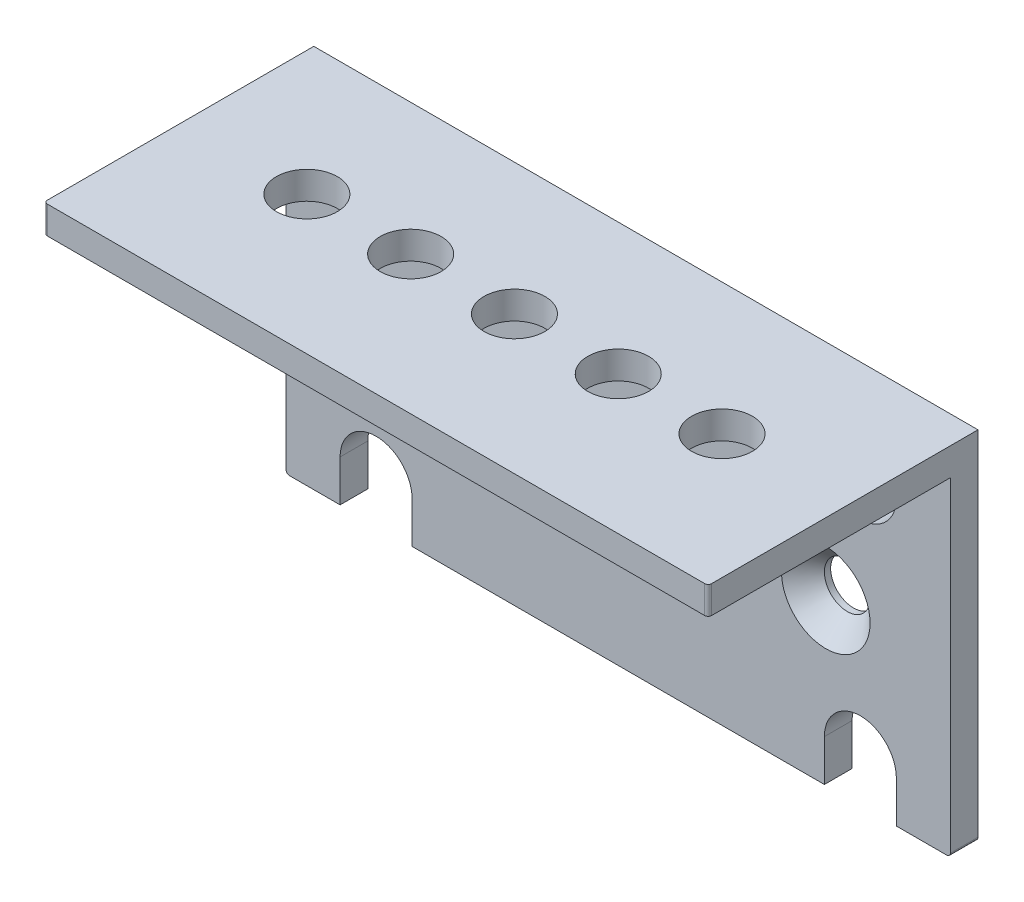
ISO-10303-21;
HEADER;
FILE_DESCRIPTION(('STEP AP214'),'2;1');
FILE_NAME('part.step','',(''),(''),'','','');
FILE_SCHEMA(('AUTOMOTIVE_DESIGN { 1 0 10303 214 1 1 1 1 }'));
ENDSEC;
DATA;
#1=APPLICATION_CONTEXT('core data for automotive mechanical design processes');
#2=APPLICATION_PROTOCOL_DEFINITION('international standard','automotive_design',2000,#1);
#3=PRODUCT_CONTEXT('',#1,'mechanical');
#4=PRODUCT('Part','Part','',(#3));
#5=PRODUCT_RELATED_PRODUCT_CATEGORY('part','',(#4));
#6=PRODUCT_DEFINITION_FORMATION('','',#4);
#7=PRODUCT_DEFINITION_CONTEXT('part definition',#1,'design');
#8=PRODUCT_DEFINITION('design','',#6,#7);
#9=PRODUCT_DEFINITION_SHAPE('','',#8);
#10=(LENGTH_UNIT() NAMED_UNIT(*) SI_UNIT(.MILLI.,.METRE.));
#11=(NAMED_UNIT(*) PLANE_ANGLE_UNIT() SI_UNIT($,.RADIAN.));
#12=(NAMED_UNIT(*) SI_UNIT($,.STERADIAN.) SOLID_ANGLE_UNIT());
#13=UNCERTAINTY_MEASURE_WITH_UNIT(LENGTH_MEASURE(1.E-05),#10,'distance_accuracy_value','');
#14=(GEOMETRIC_REPRESENTATION_CONTEXT(3) GLOBAL_UNCERTAINTY_ASSIGNED_CONTEXT((#13)) GLOBAL_UNIT_ASSIGNED_CONTEXT((#10,
#11,#12)) REPRESENTATION_CONTEXT('',''));
#15=CARTESIAN_POINT('',(0.,0.,0.));
#16=DIRECTION('',(0.,0.,1.));
#17=DIRECTION('',(1.,0.,0.));
#18=AXIS2_PLACEMENT_3D('',#15,#16,#17);
#19=CARTESIAN_POINT('',(96.,-47.,4.));
#20=DIRECTION('',(0.,1.,0.));
#21=DIRECTION('',(-1.,0.,0.));
#22=AXIS2_PLACEMENT_3D('',#19,#20,#21);
#23=PLANE('',#22);
#24=DIRECTION('',(0.,0.,1.));
#25=VECTOR('',#24,1.);
#26=CARTESIAN_POINT('',(18.2,-47.,-6.));
#27=LINE('',#26,#25);
#28=CARTESIAN_POINT('',(18.2,-47.,0.));
#29=VERTEX_POINT('',#28);
#30=CARTESIAN_POINT('',(18.2,-47.,4.));
#31=VERTEX_POINT('',#30);
#32=EDGE_CURVE('E219',#29,#31,#27,.T.);
#33=ORIENTED_EDGE('',*,*,#32,.F.);
#34=DIRECTION('',(1.,0.,0.));
#35=VECTOR('',#34,1.);
#36=CARTESIAN_POINT('',(96.,-47.,0.));
#37=LINE('',#36,#35);
#38=CARTESIAN_POINT('',(77.8,-47.,0.));
#39=VERTEX_POINT('',#38);
#40=EDGE_CURVE('E301',#29,#39,#37,.T.);
#41=ORIENTED_EDGE('',*,*,#40,.T.);
#42=DIRECTION('',(0.,0.,1.));
#43=VECTOR('',#42,1.);
#44=CARTESIAN_POINT('',(77.8,-47.,-6.));
#45=LINE('',#44,#43);
#46=CARTESIAN_POINT('',(77.8,-47.,4.));
#47=VERTEX_POINT('',#46);
#48=EDGE_CURVE('E552',#39,#47,#45,.T.);
#49=ORIENTED_EDGE('',*,*,#48,.T.);
#50=DIRECTION('',(1.,0.,0.));
#51=VECTOR('',#50,1.);
#52=CARTESIAN_POINT('',(96.,-47.,4.));
#53=LINE('',#52,#51);
#54=EDGE_CURVE('E293',#31,#47,#53,.T.);
#55=ORIENTED_EDGE('',*,*,#54,.F.);
#56=EDGE_LOOP('',(#33,#41,#49,#55));
#57=FACE_BOUND('',#56,.T.);
#58=ADVANCED_FACE('F53',(#57),#23,.F.);
#59=CARTESIAN_POINT('',(0.500000000000028,-47.,4.));
#60=VERTEX_POINT('',#59);
#61=CARTESIAN_POINT('',(7.80000000000001,-47.,4.));
#62=VERTEX_POINT('',#61);
#63=EDGE_CURVE('E290',#60,#62,#53,.T.);
#64=ORIENTED_EDGE('',*,*,#63,.F.);
#65=DIRECTION('',(0.,0.,-1.));
#66=VECTOR('',#65,1.);
#67=CARTESIAN_POINT('',(0.5,-47.,4.));
#68=LINE('',#67,#66);
#69=CARTESIAN_POINT('',(0.500000000000028,-47.,0.));
#70=VERTEX_POINT('',#69);
#71=EDGE_CURVE('E320',#60,#70,#68,.T.);
#72=ORIENTED_EDGE('',*,*,#71,.T.);
#73=CARTESIAN_POINT('',(7.80000000000004,-47.,0.));
#74=VERTEX_POINT('',#73);
#75=EDGE_CURVE('E299',#70,#74,#37,.T.);
#76=ORIENTED_EDGE('',*,*,#75,.T.);
#77=DIRECTION('',(0.,0.,1.));
#78=VECTOR('',#77,1.);
#79=CARTESIAN_POINT('',(7.80000000000001,-47.,-6.));
#80=LINE('',#79,#78);
#81=EDGE_CURVE('E216',#74,#62,#80,.T.);
#82=ORIENTED_EDGE('',*,*,#81,.T.);
#83=EDGE_LOOP('',(#64,#72,#76,#82));
#84=FACE_BOUND('',#83,.T.);
#85=ADVANCED_FACE('F383',(#84),#23,.F.);
#86=CARTESIAN_POINT('',(88.2,-47.,0.));
#87=VERTEX_POINT('',#86);
#88=CARTESIAN_POINT('',(95.5,-47.,0.));
#89=VERTEX_POINT('',#88);
#90=EDGE_CURVE('E298',#87,#89,#37,.T.);
#91=ORIENTED_EDGE('',*,*,#90,.T.);
#92=DIRECTION('',(0.,0.,-1.));
#93=VECTOR('',#92,1.);
#94=CARTESIAN_POINT('',(95.5,-47.,4.));
#95=LINE('',#94,#93);
#96=CARTESIAN_POINT('',(95.5,-47.,4.));
#97=VERTEX_POINT('',#96);
#98=EDGE_CURVE('E341',#89,#97,#95,.F.);
#99=ORIENTED_EDGE('',*,*,#98,.T.);
#100=CARTESIAN_POINT('',(88.2,-47.,4.));
#101=VERTEX_POINT('',#100);
#102=EDGE_CURVE('E288',#101,#97,#53,.T.);
#103=ORIENTED_EDGE('',*,*,#102,.F.);
#104=DIRECTION('',(0.,0.,1.));
#105=VECTOR('',#104,1.);
#106=CARTESIAN_POINT('',(88.2,-47.,-6.));
#107=LINE('',#106,#105);
#108=EDGE_CURVE('E189',#87,#101,#107,.T.);
#109=ORIENTED_EDGE('',*,*,#108,.F.);
#110=EDGE_LOOP('',(#91,#99,#103,#109));
#111=FACE_BOUND('',#110,.T.);
#112=ADVANCED_FACE('F386',(#111),#23,.F.);
#113=CARTESIAN_POINT('',(0.,0.,4.));
#114=DIRECTION('',(0.,0.,-1.));
#115=DIRECTION('',(-1.,0.,0.));
#116=AXIS2_PLACEMENT_3D('',#113,#114,#115);
#117=PLANE('',#116);
#118=CARTESIAN_POINT('',(18.,-23.5,4.));
#119=DIRECTION('',(0.,0.,1.));
#120=DIRECTION('',(1.,0.,0.));
#121=AXIS2_PLACEMENT_3D('',#118,#119,#120);
#122=CIRCLE('',#121,6.4);
#123=CARTESIAN_POINT('',(24.4,-23.5,4.));
#124=VERTEX_POINT('',#123);
#125=EDGE_CURVE('E528',#124,#124,#122,.T.);
#126=ORIENTED_EDGE('',*,*,#125,.F.);
#127=EDGE_LOOP('',(#126));
#128=FACE_BOUND('',#127,.T.);
#129=CARTESIAN_POINT('',(48.,-23.5,4.));
#130=DIRECTION('',(0.,0.,1.));
#131=DIRECTION('',(1.,0.,0.));
#132=AXIS2_PLACEMENT_3D('',#129,#130,#131);
#133=CIRCLE('',#132,6.4);
#134=CARTESIAN_POINT('',(54.4,-23.5,4.));
#135=VERTEX_POINT('',#134);
#136=EDGE_CURVE('E534',#135,#135,#133,.T.);
#137=ORIENTED_EDGE('',*,*,#136,.F.);
#138=EDGE_LOOP('',(#137));
#139=FACE_BOUND('',#138,.T.);
#140=CARTESIAN_POINT('',(78.,-23.5,4.));
#141=DIRECTION('',(0.,0.,1.));
#142=DIRECTION('',(1.,0.,0.));
#143=AXIS2_PLACEMENT_3D('',#140,#141,#142);
#144=CIRCLE('',#143,6.4);
#145=CARTESIAN_POINT('',(84.4,-23.5,4.));
#146=VERTEX_POINT('',#145);
#147=EDGE_CURVE('E543',#146,#146,#144,.T.);
#148=ORIENTED_EDGE('',*,*,#147,.F.);
#149=EDGE_LOOP('',(#148));
#150=FACE_BOUND('',#149,.T.);
#151=DIRECTION('',(0.,-1.,0.));
#152=VECTOR('',#151,1.);
#153=CARTESIAN_POINT('',(0.,-47.,4.));
#154=LINE('',#153,#152);
#155=CARTESIAN_POINT('',(0.,0.5,4.));
#156=VERTEX_POINT('',#155);
#157=CARTESIAN_POINT('',(0.,-46.5,4.));
#158=VERTEX_POINT('',#157);
#159=EDGE_CURVE('E286',#156,#158,#154,.T.);
#160=ORIENTED_EDGE('',*,*,#159,.T.);
#161=CARTESIAN_POINT('',(0.5,-46.5,4.));
#162=DIRECTION('',(0.,0.,-1.));
#163=DIRECTION('',(-1.,0.,0.));
#164=AXIS2_PLACEMENT_3D('',#161,#162,#163);
#165=CIRCLE('',#164,0.5);
#166=EDGE_CURVE('E333',#158,#60,#165,.F.);
#167=ORIENTED_EDGE('',*,*,#166,.T.);
#168=ORIENTED_EDGE('',*,*,#63,.T.);
#169=DIRECTION('',(0.,1.,0.));
#170=VECTOR('',#169,1.);
#171=CARTESIAN_POINT('',(7.80000000000002,0.,4.));
#172=LINE('',#171,#170);
#173=CARTESIAN_POINT('',(7.80000000000001,-41.,4.));
#174=VERTEX_POINT('',#173);
#175=EDGE_CURVE('E226',#62,#174,#172,.T.);
#176=ORIENTED_EDGE('',*,*,#175,.T.);
#177=CARTESIAN_POINT('',(13.,-41.,4.));
#178=DIRECTION('',(0.,0.,1.));
#179=DIRECTION('',(1.,0.,0.));
#180=AXIS2_PLACEMENT_3D('',#177,#178,#179);
#181=CIRCLE('',#180,5.2);
#182=CARTESIAN_POINT('',(18.2,-41.,4.));
#183=VERTEX_POINT('',#182);
#184=EDGE_CURVE('E190',#183,#174,#181,.T.);
#185=ORIENTED_EDGE('',*,*,#184,.F.);
#186=DIRECTION('',(0.,-1.,0.));
#187=VECTOR('',#186,1.);
#188=CARTESIAN_POINT('',(18.2,0.,4.));
#189=LINE('',#188,#187);
#190=EDGE_CURVE('E215',#183,#31,#189,.T.);
#191=ORIENTED_EDGE('',*,*,#190,.T.);
#192=ORIENTED_EDGE('',*,*,#54,.T.);
#193=DIRECTION('',(0.,-1.,0.));
#194=VECTOR('',#193,1.);
#195=CARTESIAN_POINT('',(77.8,0.,4.));
#196=LINE('',#195,#194);
#197=CARTESIAN_POINT('',(77.8,-41.,4.));
#198=VERTEX_POINT('',#197);
#199=EDGE_CURVE('E199',#198,#47,#196,.T.);
#200=ORIENTED_EDGE('',*,*,#199,.F.);
#201=CARTESIAN_POINT('',(83.,-41.,4.));
#202=DIRECTION('',(0.,0.,1.));
#203=DIRECTION('',(1.,0.,0.));
#204=AXIS2_PLACEMENT_3D('',#201,#202,#203);
#205=CIRCLE('',#204,5.19999999999999);
#206=CARTESIAN_POINT('',(88.2,-41.,4.));
#207=VERTEX_POINT('',#206);
#208=EDGE_CURVE('E183',#198,#207,#205,.F.);
#209=ORIENTED_EDGE('',*,*,#208,.T.);
#210=DIRECTION('',(0.,1.,0.));
#211=VECTOR('',#210,1.);
#212=CARTESIAN_POINT('',(88.2,0.,4.));
#213=LINE('',#212,#211);
#214=EDGE_CURVE('E193',#101,#207,#213,.T.);
#215=ORIENTED_EDGE('',*,*,#214,.F.);
#216=ORIENTED_EDGE('',*,*,#102,.T.);
#217=CARTESIAN_POINT('',(95.5,-46.5,4.));
#218=DIRECTION('',(0.,0.,-1.));
#219=DIRECTION('',(-1.,0.,0.));
#220=AXIS2_PLACEMENT_3D('',#217,#218,#219);
#221=CIRCLE('',#220,0.5);
#222=CARTESIAN_POINT('',(96.,-46.5,4.));
#223=VERTEX_POINT('',#222);
#224=EDGE_CURVE('E331',#97,#223,#221,.F.);
#225=ORIENTED_EDGE('',*,*,#224,.T.);
#226=DIRECTION('',(0.,1.,0.));
#227=VECTOR('',#226,1.);
#228=CARTESIAN_POINT('',(96.,0.,4.));
#229=LINE('',#228,#227);
#230=CARTESIAN_POINT('',(96.,0.5,4.));
#231=VERTEX_POINT('',#230);
#232=EDGE_CURVE('E292',#223,#231,#229,.T.);
#233=ORIENTED_EDGE('',*,*,#232,.T.);
#234=DIRECTION('',(1.,0.,0.));
#235=VECTOR('',#234,1.);
#236=CARTESIAN_POINT('',(0.,0.5,4.));
#237=LINE('',#236,#235);
#238=EDGE_CURVE('E249',#156,#231,#237,.T.);
#239=ORIENTED_EDGE('',*,*,#238,.F.);
#240=EDGE_LOOP('',(#160,#167,#168,#176,#185,#191,#192,#200,#209,#215,#216,#225,#233,#239));
#241=FACE_BOUND('',#240,.T.);
#242=CARTESIAN_POINT('',(13.,-6.00000000000001,4.));
#243=DIRECTION('',(0.,0.,1.));
#244=DIRECTION('',(1.,0.,0.));
#245=AXIS2_PLACEMENT_3D('',#242,#243,#244);
#246=CIRCLE('',#245,5.2);
#247=CARTESIAN_POINT('',(18.2,-6.00000000000001,4.));
#248=VERTEX_POINT('',#247);
#249=EDGE_CURVE('E209',#248,#248,#246,.F.);
#250=ORIENTED_EDGE('',*,*,#249,.T.);
#251=EDGE_LOOP('',(#250));
#252=FACE_BOUND('',#251,.T.);
#253=CARTESIAN_POINT('',(83.,-6.,4.));
#254=DIRECTION('',(0.,0.,1.));
#255=DIRECTION('',(1.,0.,0.));
#256=AXIS2_PLACEMENT_3D('',#253,#254,#255);
#257=CIRCLE('',#256,5.19999999999999);
#258=CARTESIAN_POINT('',(88.2,-6.,4.));
#259=VERTEX_POINT('',#258);
#260=EDGE_CURVE('E206',#259,#259,#257,.T.);
#261=ORIENTED_EDGE('',*,*,#260,.F.);
#262=EDGE_LOOP('',(#261));
#263=FACE_BOUND('',#262,.T.);
#264=ADVANCED_FACE('F203',(#128,#139,#150,#241,#252,#263),#117,.F.);
#265=CARTESIAN_POINT('',(0.,0.,0.));
#266=DIRECTION('',(0.,0.,-1.));
#267=DIRECTION('',(-1.,0.,0.));
#268=AXIS2_PLACEMENT_3D('',#265,#266,#267);
#269=PLANE('',#268);
#270=CARTESIAN_POINT('',(18.,-23.5,0.));
#271=DIRECTION('',(0.,0.,1.));
#272=DIRECTION('',(1.,0.,0.));
#273=AXIS2_PLACEMENT_3D('',#270,#271,#272);
#274=CIRCLE('',#273,3.3);
#275=CARTESIAN_POINT('',(21.3,-23.5,0.));
#276=VERTEX_POINT('',#275);
#277=EDGE_CURVE('E530',#276,#276,#274,.T.);
#278=ORIENTED_EDGE('',*,*,#277,.T.);
#279=EDGE_LOOP('',(#278));
#280=FACE_BOUND('',#279,.T.);
#281=CARTESIAN_POINT('',(48.,-23.5,0.));
#282=DIRECTION('',(0.,0.,1.));
#283=DIRECTION('',(1.,0.,0.));
#284=AXIS2_PLACEMENT_3D('',#281,#282,#283);
#285=CIRCLE('',#284,3.3);
#286=CARTESIAN_POINT('',(51.3,-23.5,0.));
#287=VERTEX_POINT('',#286);
#288=EDGE_CURVE('E540',#287,#287,#285,.T.);
#289=ORIENTED_EDGE('',*,*,#288,.T.);
#290=EDGE_LOOP('',(#289));
#291=FACE_BOUND('',#290,.T.);
#292=CARTESIAN_POINT('',(78.,-23.5,0.));
#293=DIRECTION('',(0.,0.,1.));
#294=DIRECTION('',(1.,0.,0.));
#295=AXIS2_PLACEMENT_3D('',#292,#293,#294);
#296=CIRCLE('',#295,3.3);
#297=CARTESIAN_POINT('',(81.3,-23.5,0.));
#298=VERTEX_POINT('',#297);
#299=EDGE_CURVE('E223',#298,#298,#296,.T.);
#300=ORIENTED_EDGE('',*,*,#299,.T.);
#301=EDGE_LOOP('',(#300));
#302=FACE_BOUND('',#301,.T.);
#303=CARTESIAN_POINT('',(83.,-6.,0.));
#304=DIRECTION('',(0.,0.,-1.));
#305=DIRECTION('',(-1.,0.,0.));
#306=AXIS2_PLACEMENT_3D('',#303,#304,#305);
#307=CIRCLE('',#306,5.19999999999999);
#308=CARTESIAN_POINT('',(77.8,-6.,0.));
#309=VERTEX_POINT('',#308);
#310=EDGE_CURVE('E238',#309,#309,#307,.T.);
#311=ORIENTED_EDGE('',*,*,#310,.F.);
#312=EDGE_LOOP('',(#311));
#313=FACE_BOUND('',#312,.T.);
#314=CARTESIAN_POINT('',(13.,-6.00000000000001,0.));
#315=DIRECTION('',(0.,0.,-1.));
#316=DIRECTION('',(-1.,0.,0.));
#317=AXIS2_PLACEMENT_3D('',#314,#315,#316);
#318=CIRCLE('',#317,5.2);
#319=CARTESIAN_POINT('',(7.8,-6.00000000000001,0.));
#320=VERTEX_POINT('',#319);
#321=EDGE_CURVE('E233',#320,#320,#318,.F.);
#322=ORIENTED_EDGE('',*,*,#321,.T.);
#323=EDGE_LOOP('',(#322));
#324=FACE_BOUND('',#323,.T.);
#325=ORIENTED_EDGE('',*,*,#75,.F.);
#326=CARTESIAN_POINT('',(0.5,-46.5,0.));
#327=DIRECTION('',(0.,0.,-1.));
#328=DIRECTION('',(-1.,0.,0.));
#329=AXIS2_PLACEMENT_3D('',#326,#327,#328);
#330=CIRCLE('',#329,0.5);
#331=CARTESIAN_POINT('',(0.,-46.5,0.));
#332=VERTEX_POINT('',#331);
#333=EDGE_CURVE('E325',#70,#332,#330,.T.);
#334=ORIENTED_EDGE('',*,*,#333,.T.);
#335=DIRECTION('',(0.,-1.,0.));
#336=VECTOR('',#335,1.);
#337=CARTESIAN_POINT('',(0.,-47.,0.));
#338=LINE('',#337,#336);
#339=CARTESIAN_POINT('',(0.,4.5,0.));
#340=VERTEX_POINT('',#339);
#341=EDGE_CURVE('E285',#340,#332,#338,.T.);
#342=ORIENTED_EDGE('',*,*,#341,.F.);
#343=DIRECTION('',(-1.,0.,0.));
#344=VECTOR('',#343,1.);
#345=CARTESIAN_POINT('',(0.,4.5,0.));
#346=LINE('',#345,#344);
#347=CARTESIAN_POINT('',(96.,4.5,0.));
#348=VERTEX_POINT('',#347);
#349=EDGE_CURVE('E263',#348,#340,#346,.T.);
#350=ORIENTED_EDGE('',*,*,#349,.F.);
#351=DIRECTION('',(0.,1.,0.));
#352=VECTOR('',#351,1.);
#353=CARTESIAN_POINT('',(96.,0.,0.));
#354=LINE('',#353,#352);
#355=CARTESIAN_POINT('',(96.,-46.5,0.));
#356=VERTEX_POINT('',#355);
#357=EDGE_CURVE('E289',#356,#348,#354,.T.);
#358=ORIENTED_EDGE('',*,*,#357,.F.);
#359=CARTESIAN_POINT('',(95.5,-46.5,0.));
#360=DIRECTION('',(0.,0.,-1.));
#361=DIRECTION('',(-1.,0.,0.));
#362=AXIS2_PLACEMENT_3D('',#359,#360,#361);
#363=CIRCLE('',#362,0.5);
#364=EDGE_CURVE('E323',#356,#89,#363,.T.);
#365=ORIENTED_EDGE('',*,*,#364,.T.);
#366=ORIENTED_EDGE('',*,*,#90,.F.);
#367=DIRECTION('',(0.,-1.,0.));
#368=VECTOR('',#367,1.);
#369=CARTESIAN_POINT('',(88.2,0.,0.));
#370=LINE('',#369,#368);
#371=CARTESIAN_POINT('',(88.2,-41.,0.));
#372=VERTEX_POINT('',#371);
#373=EDGE_CURVE('E310',#372,#87,#370,.T.);
#374=ORIENTED_EDGE('',*,*,#373,.F.);
#375=CARTESIAN_POINT('',(83.,-41.,0.));
#376=DIRECTION('',(0.,0.,-1.));
#377=DIRECTION('',(-1.,0.,0.));
#378=AXIS2_PLACEMENT_3D('',#375,#376,#377);
#379=CIRCLE('',#378,5.19999999999999);
#380=CARTESIAN_POINT('',(77.8,-41.,0.));
#381=VERTEX_POINT('',#380);
#382=EDGE_CURVE('E186',#372,#381,#379,.F.);
#383=ORIENTED_EDGE('',*,*,#382,.T.);
#384=DIRECTION('',(0.,1.,0.));
#385=VECTOR('',#384,1.);
#386=CARTESIAN_POINT('',(77.8,0.,0.));
#387=LINE('',#386,#385);
#388=EDGE_CURVE('E295',#39,#381,#387,.T.);
#389=ORIENTED_EDGE('',*,*,#388,.F.);
#390=ORIENTED_EDGE('',*,*,#40,.F.);
#391=DIRECTION('',(0.,1.,0.));
#392=VECTOR('',#391,1.);
#393=CARTESIAN_POINT('',(18.2,0.,0.));
#394=LINE('',#393,#392);
#395=CARTESIAN_POINT('',(18.2,-41.,0.));
#396=VERTEX_POINT('',#395);
#397=EDGE_CURVE('E317',#29,#396,#394,.T.);
#398=ORIENTED_EDGE('',*,*,#397,.T.);
#399=CARTESIAN_POINT('',(13.,-41.,0.));
#400=DIRECTION('',(0.,0.,-1.));
#401=DIRECTION('',(-1.,0.,0.));
#402=AXIS2_PLACEMENT_3D('',#399,#400,#401);
#403=CIRCLE('',#402,5.2);
#404=CARTESIAN_POINT('',(7.80000000000001,-41.,0.));
#405=VERTEX_POINT('',#404);
#406=EDGE_CURVE('E315',#405,#396,#403,.T.);
#407=ORIENTED_EDGE('',*,*,#406,.F.);
#408=DIRECTION('',(0.,-1.,0.));
#409=VECTOR('',#408,1.);
#410=CARTESIAN_POINT('',(7.80000000000002,0.,0.));
#411=LINE('',#410,#409);
#412=EDGE_CURVE('E312',#405,#74,#411,.T.);
#413=ORIENTED_EDGE('',*,*,#412,.T.);
#414=EDGE_LOOP('',(#325,#334,#342,#350,#358,#365,#366,#374,#383,#389,#390,#398,#407,#413));
#415=FACE_BOUND('',#414,.T.);
#416=ADVANCED_FACE('F399',(#280,#291,#302,#313,#324,#415),#269,.T.);
#417=CARTESIAN_POINT('',(0.,-47.,4.));
#418=DIRECTION('',(1.,0.,0.));
#419=DIRECTION('',(0.,1.,0.));
#420=AXIS2_PLACEMENT_3D('',#417,#418,#419);
#421=PLANE('',#420);
#422=ORIENTED_EDGE('',*,*,#341,.T.);
#423=DIRECTION('',(0.,0.,-1.));
#424=VECTOR('',#423,1.);
#425=CARTESIAN_POINT('',(0.,-46.5,4.));
#426=LINE('',#425,#424);
#427=EDGE_CURVE('E329',#332,#158,#426,.F.);
#428=ORIENTED_EDGE('',*,*,#427,.T.);
#429=ORIENTED_EDGE('',*,*,#159,.F.);
#430=DIRECTION('',(0.,0.,1.));
#431=VECTOR('',#430,1.);
#432=CARTESIAN_POINT('',(0.,0.5,0.));
#433=LINE('',#432,#431);
#434=CARTESIAN_POINT('',(0.,0.5,38.5));
#435=VERTEX_POINT('',#434);
#436=EDGE_CURVE('E241',#156,#435,#433,.T.);
#437=ORIENTED_EDGE('',*,*,#436,.T.);
#438=DIRECTION('',(0.,-1.,0.));
#439=VECTOR('',#438,1.);
#440=CARTESIAN_POINT('',(0.,-47.,38.5));
#441=LINE('',#440,#439);
#442=CARTESIAN_POINT('',(0.,4.5,38.5));
#443=VERTEX_POINT('',#442);
#444=EDGE_CURVE('E327',#435,#443,#441,.F.);
#445=ORIENTED_EDGE('',*,*,#444,.T.);
#446=DIRECTION('',(0.,0.,1.));
#447=VECTOR('',#446,1.);
#448=CARTESIAN_POINT('',(0.,4.5,0.));
#449=LINE('',#448,#447);
#450=EDGE_CURVE('E266',#340,#443,#449,.T.);
#451=ORIENTED_EDGE('',*,*,#450,.F.);
#452=EDGE_LOOP('',(#422,#428,#429,#437,#445,#451));
#453=FACE_BOUND('',#452,.T.);
#454=ADVANCED_FACE('F374',(#453),#421,.F.);
#455=CARTESIAN_POINT('',(96.,0.,4.));
#456=DIRECTION('',(-1.,0.,0.));
#457=DIRECTION('',(0.,-1.,0.));
#458=AXIS2_PLACEMENT_3D('',#455,#456,#457);
#459=PLANE('',#458);
#460=ORIENTED_EDGE('',*,*,#232,.F.);
#461=DIRECTION('',(0.,0.,-1.));
#462=VECTOR('',#461,1.);
#463=CARTESIAN_POINT('',(96.,-46.5,4.));
#464=LINE('',#463,#462);
#465=EDGE_CURVE('E338',#223,#356,#464,.T.);
#466=ORIENTED_EDGE('',*,*,#465,.T.);
#467=ORIENTED_EDGE('',*,*,#357,.T.);
#468=DIRECTION('',(0.,0.,-1.));
#469=VECTOR('',#468,1.);
#470=CARTESIAN_POINT('',(96.,4.5,0.));
#471=LINE('',#470,#469);
#472=CARTESIAN_POINT('',(96.,4.5,38.5));
#473=VERTEX_POINT('',#472);
#474=EDGE_CURVE('E261',#473,#348,#471,.T.);
#475=ORIENTED_EDGE('',*,*,#474,.F.);
#476=DIRECTION('',(0.,-1.,0.));
#477=VECTOR('',#476,1.);
#478=CARTESIAN_POINT('',(96.,0.,38.5));
#479=LINE('',#478,#477);
#480=CARTESIAN_POINT('',(96.,0.5,38.5));
#481=VERTEX_POINT('',#480);
#482=EDGE_CURVE('E335',#473,#481,#479,.T.);
#483=ORIENTED_EDGE('',*,*,#482,.T.);
#484=DIRECTION('',(0.,0.,1.));
#485=VECTOR('',#484,1.);
#486=CARTESIAN_POINT('',(96.,0.5,0.));
#487=LINE('',#486,#485);
#488=EDGE_CURVE('E246',#231,#481,#487,.T.);
#489=ORIENTED_EDGE('',*,*,#488,.F.);
#490=EDGE_LOOP('',(#460,#466,#467,#475,#483,#489));
#491=FACE_BOUND('',#490,.T.);
#492=ADVANCED_FACE('F366',(#491),#459,.F.);
#493=CARTESIAN_POINT('',(48.,4.5,19.));
#494=DIRECTION('',(0.,-1.,0.));
#495=DIRECTION('',(0.,0.,-1.));
#496=AXIS2_PLACEMENT_3D('',#493,#494,#495);
#497=CYLINDRICAL_SURFACE('',#496,4.4);
#498=CARTESIAN_POINT('',(48.,0.5,19.));
#499=DIRECTION('',(0.,1.,0.));
#500=DIRECTION('',(0.,0.,1.));
#501=AXIS2_PLACEMENT_3D('',#498,#499,#500);
#502=CIRCLE('',#501,4.4);
#503=CARTESIAN_POINT('',(48.,0.5,23.4));
#504=VERTEX_POINT('',#503);
#505=EDGE_CURVE('E255',#504,#504,#502,.F.);
#506=ORIENTED_EDGE('',*,*,#505,.T.);
#507=EDGE_LOOP('',(#506));
#508=FACE_BOUND('',#507,.T.);
#509=CARTESIAN_POINT('',(48.,4.5,19.));
#510=DIRECTION('',(0.,1.,0.));
#511=DIRECTION('',(0.,0.,1.));
#512=AXIS2_PLACEMENT_3D('',#509,#510,#511);
#513=CIRCLE('',#512,4.4);
#514=CARTESIAN_POINT('',(48.,4.5,23.4));
#515=VERTEX_POINT('',#514);
#516=EDGE_CURVE('E279',#515,#515,#513,.F.);
#517=ORIENTED_EDGE('',*,*,#516,.F.);
#518=EDGE_LOOP('',(#517));
#519=FACE_BOUND('',#518,.T.);
#520=ADVANCED_FACE('F420',(#508,#519),#497,.F.);
#521=CARTESIAN_POINT('',(18.,4.5,19.));
#522=DIRECTION('',(0.,-1.,0.));
#523=DIRECTION('',(0.,0.,-1.));
#524=AXIS2_PLACEMENT_3D('',#521,#522,#523);
#525=CYLINDRICAL_SURFACE('',#524,4.4);
#526=CARTESIAN_POINT('',(18.,0.5,19.));
#527=DIRECTION('',(0.,1.,0.));
#528=DIRECTION('',(0.,0.,1.));
#529=AXIS2_PLACEMENT_3D('',#526,#527,#528);
#530=CIRCLE('',#529,4.4);
#531=CARTESIAN_POINT('',(18.,0.5,23.4));
#532=VERTEX_POINT('',#531);
#533=EDGE_CURVE('E252',#532,#532,#530,.T.);
#534=ORIENTED_EDGE('',*,*,#533,.F.);
#535=EDGE_LOOP('',(#534));
#536=FACE_BOUND('',#535,.T.);
#537=CARTESIAN_POINT('',(18.,4.5,19.));
#538=DIRECTION('',(0.,1.,0.));
#539=DIRECTION('',(0.,0.,1.));
#540=AXIS2_PLACEMENT_3D('',#537,#538,#539);
#541=CIRCLE('',#540,4.4);
#542=CARTESIAN_POINT('',(18.,4.5,23.4));
#543=VERTEX_POINT('',#542);
#544=EDGE_CURVE('E276',#543,#543,#541,.T.);
#545=ORIENTED_EDGE('',*,*,#544,.T.);
#546=EDGE_LOOP('',(#545));
#547=FACE_BOUND('',#546,.T.);
#548=ADVANCED_FACE('F424',(#536,#547),#525,.F.);
#549=CARTESIAN_POINT('',(63.,4.5,19.));
#550=DIRECTION('',(0.,-1.,0.));
#551=DIRECTION('',(0.,0.,-1.));
#552=AXIS2_PLACEMENT_3D('',#549,#550,#551);
#553=CYLINDRICAL_SURFACE('',#552,4.4);
#554=CARTESIAN_POINT('',(63.,0.5,19.));
#555=DIRECTION('',(0.,1.,0.));
#556=DIRECTION('',(0.,0.,1.));
#557=AXIS2_PLACEMENT_3D('',#554,#555,#556);
#558=CIRCLE('',#557,4.4);
#559=CARTESIAN_POINT('',(63.,0.5,23.4));
#560=VERTEX_POINT('',#559);
#561=EDGE_CURVE('E237',#560,#560,#558,.T.);
#562=ORIENTED_EDGE('',*,*,#561,.F.);
#563=EDGE_LOOP('',(#562));
#564=FACE_BOUND('',#563,.T.);
#565=CARTESIAN_POINT('',(63.,4.5,19.));
#566=DIRECTION('',(0.,1.,0.));
#567=DIRECTION('',(0.,0.,1.));
#568=AXIS2_PLACEMENT_3D('',#565,#566,#567);
#569=CIRCLE('',#568,4.4);
#570=CARTESIAN_POINT('',(63.,4.5,23.4));
#571=VERTEX_POINT('',#570);
#572=EDGE_CURVE('E273',#571,#571,#569,.T.);
#573=ORIENTED_EDGE('',*,*,#572,.T.);
#574=EDGE_LOOP('',(#573));
#575=FACE_BOUND('',#574,.T.);
#576=ADVANCED_FACE('F430',(#564,#575),#553,.F.);
#577=CARTESIAN_POINT('',(78.,4.5,19.));
#578=DIRECTION('',(0.,-1.,0.));
#579=DIRECTION('',(0.,0.,-1.));
#580=AXIS2_PLACEMENT_3D('',#577,#578,#579);
#581=CYLINDRICAL_SURFACE('',#580,4.4);
#582=CARTESIAN_POINT('',(78.,0.5,19.));
#583=DIRECTION('',(0.,1.,0.));
#584=DIRECTION('',(0.,0.,1.));
#585=AXIS2_PLACEMENT_3D('',#582,#583,#584);
#586=CIRCLE('',#585,4.4);
#587=CARTESIAN_POINT('',(78.,0.5,23.4));
#588=VERTEX_POINT('',#587);
#589=EDGE_CURVE('E234',#588,#588,#586,.F.);
#590=ORIENTED_EDGE('',*,*,#589,.T.);
#591=EDGE_LOOP('',(#590));
#592=FACE_BOUND('',#591,.T.);
#593=CARTESIAN_POINT('',(78.,4.5,19.));
#594=DIRECTION('',(0.,1.,0.));
#595=DIRECTION('',(0.,0.,1.));
#596=AXIS2_PLACEMENT_3D('',#593,#594,#595);
#597=CIRCLE('',#596,4.4);
#598=CARTESIAN_POINT('',(78.,4.5,23.4));
#599=VERTEX_POINT('',#598);
#600=EDGE_CURVE('E270',#599,#599,#597,.F.);
#601=ORIENTED_EDGE('',*,*,#600,.F.);
#602=EDGE_LOOP('',(#601));
#603=FACE_BOUND('',#602,.T.);
#604=ADVANCED_FACE('F440',(#592,#603),#581,.F.);
#605=CARTESIAN_POINT('',(0.,4.5,39.));
#606=DIRECTION('',(0.,0.,-1.));
#607=DIRECTION('',(-1.,0.,0.));
#608=AXIS2_PLACEMENT_3D('',#605,#606,#607);
#609=PLANE('',#608);
#610=DIRECTION('',(1.,0.,0.));
#611=VECTOR('',#610,1.);
#612=CARTESIAN_POINT('',(0.,0.5,39.));
#613=LINE('',#612,#611);
#614=CARTESIAN_POINT('',(0.5,0.5,39.));
#615=VERTEX_POINT('',#614);
#616=CARTESIAN_POINT('',(95.5,0.5,39.));
#617=VERTEX_POINT('',#616);
#618=EDGE_CURVE('E244',#615,#617,#613,.T.);
#619=ORIENTED_EDGE('',*,*,#618,.T.);
#620=DIRECTION('',(0.,-1.,0.));
#621=VECTOR('',#620,1.);
#622=CARTESIAN_POINT('',(95.5,4.50000000000003,39.));
#623=LINE('',#622,#621);
#624=CARTESIAN_POINT('',(95.5,4.5,39.));
#625=VERTEX_POINT('',#624);
#626=EDGE_CURVE('E68',#617,#625,#623,.F.);
#627=ORIENTED_EDGE('',*,*,#626,.T.);
#628=DIRECTION('',(1.,0.,0.));
#629=VECTOR('',#628,1.);
#630=CARTESIAN_POINT('',(0.,4.5,39.));
#631=LINE('',#630,#629);
#632=CARTESIAN_POINT('',(0.5,4.5,39.));
#633=VERTEX_POINT('',#632);
#634=EDGE_CURVE('E268',#633,#625,#631,.T.);
#635=ORIENTED_EDGE('',*,*,#634,.F.);
#636=DIRECTION('',(0.,-1.,0.));
#637=VECTOR('',#636,1.);
#638=CARTESIAN_POINT('',(0.5,4.5,39.));
#639=LINE('',#638,#637);
#640=EDGE_CURVE('E347',#633,#615,#639,.T.);
#641=ORIENTED_EDGE('',*,*,#640,.T.);
#642=EDGE_LOOP('',(#619,#627,#635,#641));
#643=FACE_BOUND('',#642,.T.);
#644=ADVANCED_FACE('F352',(#643),#609,.F.);
#645=CARTESIAN_POINT('',(33.,4.5,19.));
#646=DIRECTION('',(0.,-1.,0.));
#647=DIRECTION('',(0.,0.,-1.));
#648=AXIS2_PLACEMENT_3D('',#645,#646,#647);
#649=CYLINDRICAL_SURFACE('',#648,4.4);
#650=CARTESIAN_POINT('',(33.,0.5,19.));
#651=DIRECTION('',(0.,1.,0.));
#652=DIRECTION('',(0.,0.,1.));
#653=AXIS2_PLACEMENT_3D('',#650,#651,#652);
#654=CIRCLE('',#653,4.4);
#655=CARTESIAN_POINT('',(33.,0.5,23.4));
#656=VERTEX_POINT('',#655);
#657=EDGE_CURVE('E258',#656,#656,#654,.F.);
#658=ORIENTED_EDGE('',*,*,#657,.T.);
#659=EDGE_LOOP('',(#658));
#660=FACE_BOUND('',#659,.T.);
#661=CARTESIAN_POINT('',(33.,4.5,19.));
#662=DIRECTION('',(0.,1.,0.));
#663=DIRECTION('',(0.,0.,1.));
#664=AXIS2_PLACEMENT_3D('',#661,#662,#663);
#665=CIRCLE('',#664,4.4);
#666=CARTESIAN_POINT('',(33.,4.5,23.4));
#667=VERTEX_POINT('',#666);
#668=EDGE_CURVE('E282',#667,#667,#665,.F.);
#669=ORIENTED_EDGE('',*,*,#668,.F.);
#670=EDGE_LOOP('',(#669));
#671=FACE_BOUND('',#670,.T.);
#672=ADVANCED_FACE('F435',(#660,#671),#649,.F.);
#673=CARTESIAN_POINT('',(0.,4.5,0.));
#674=DIRECTION('',(0.,1.,0.));
#675=DIRECTION('',(0.,0.,1.));
#676=AXIS2_PLACEMENT_3D('',#673,#674,#675);
#677=PLANE('',#676);
#678=ORIENTED_EDGE('',*,*,#634,.T.);
#679=CARTESIAN_POINT('',(95.5,4.5,38.5));
#680=DIRECTION('',(0.,1.,0.));
#681=DIRECTION('',(0.,0.,1.));
#682=AXIS2_PLACEMENT_3D('',#679,#680,#681);
#683=CIRCLE('',#682,0.5);
#684=EDGE_CURVE('E12',#625,#473,#683,.T.);
#685=ORIENTED_EDGE('',*,*,#684,.T.);
#686=ORIENTED_EDGE('',*,*,#474,.T.);
#687=ORIENTED_EDGE('',*,*,#349,.T.);
#688=ORIENTED_EDGE('',*,*,#450,.T.);
#689=CARTESIAN_POINT('',(0.5,4.5,38.5));
#690=DIRECTION('',(0.,1.,0.));
#691=DIRECTION('',(0.,0.,1.));
#692=AXIS2_PLACEMENT_3D('',#689,#690,#691);
#693=CIRCLE('',#692,0.5);
#694=EDGE_CURVE('E61',#443,#633,#693,.T.);
#695=ORIENTED_EDGE('',*,*,#694,.T.);
#696=EDGE_LOOP('',(#678,#685,#686,#687,#688,#695));
#697=FACE_BOUND('',#696,.T.);
#698=ORIENTED_EDGE('',*,*,#600,.T.);
#699=EDGE_LOOP('',(#698));
#700=FACE_BOUND('',#699,.T.);
#701=ORIENTED_EDGE('',*,*,#572,.F.);
#702=EDGE_LOOP('',(#701));
#703=FACE_BOUND('',#702,.T.);
#704=ORIENTED_EDGE('',*,*,#544,.F.);
#705=EDGE_LOOP('',(#704));
#706=FACE_BOUND('',#705,.T.);
#707=ORIENTED_EDGE('',*,*,#516,.T.);
#708=EDGE_LOOP('',(#707));
#709=FACE_BOUND('',#708,.T.);
#710=ORIENTED_EDGE('',*,*,#668,.T.);
#711=EDGE_LOOP('',(#710));
#712=FACE_BOUND('',#711,.T.);
#713=ADVANCED_FACE('F369',(#697,#700,#703,#706,#709,#712),#677,.T.);
#714=CARTESIAN_POINT('',(0.,0.5,0.));
#715=DIRECTION('',(0.,1.,0.));
#716=DIRECTION('',(0.,0.,1.));
#717=AXIS2_PLACEMENT_3D('',#714,#715,#716);
#718=PLANE('',#717);
#719=ORIENTED_EDGE('',*,*,#589,.F.);
#720=EDGE_LOOP('',(#719));
#721=FACE_BOUND('',#720,.T.);
#722=ORIENTED_EDGE('',*,*,#561,.T.);
#723=EDGE_LOOP('',(#722));
#724=FACE_BOUND('',#723,.T.);
#725=ORIENTED_EDGE('',*,*,#488,.T.);
#726=CARTESIAN_POINT('',(95.5,0.5,38.5));
#727=DIRECTION('',(0.,1.,0.));
#728=DIRECTION('',(0.,0.,1.));
#729=AXIS2_PLACEMENT_3D('',#726,#727,#728);
#730=CIRCLE('',#729,0.5);
#731=EDGE_CURVE('E345',#481,#617,#730,.F.);
#732=ORIENTED_EDGE('',*,*,#731,.T.);
#733=ORIENTED_EDGE('',*,*,#618,.F.);
#734=CARTESIAN_POINT('',(0.5,0.5,38.5));
#735=DIRECTION('',(0.,1.,0.));
#736=DIRECTION('',(0.,0.,1.));
#737=AXIS2_PLACEMENT_3D('',#734,#735,#736);
#738=CIRCLE('',#737,0.5);
#739=EDGE_CURVE('E343',#615,#435,#738,.F.);
#740=ORIENTED_EDGE('',*,*,#739,.T.);
#741=ORIENTED_EDGE('',*,*,#436,.F.);
#742=ORIENTED_EDGE('',*,*,#238,.T.);
#743=EDGE_LOOP('',(#725,#732,#733,#740,#741,#742));
#744=FACE_BOUND('',#743,.T.);
#745=ORIENTED_EDGE('',*,*,#533,.T.);
#746=EDGE_LOOP('',(#745));
#747=FACE_BOUND('',#746,.T.);
#748=ORIENTED_EDGE('',*,*,#505,.F.);
#749=EDGE_LOOP('',(#748));
#750=FACE_BOUND('',#749,.T.);
#751=ORIENTED_EDGE('',*,*,#657,.F.);
#752=EDGE_LOOP('',(#751));
#753=FACE_BOUND('',#752,.T.);
#754=ADVANCED_FACE('F355',(#721,#724,#744,#747,#750,#753),#718,.F.);
#755=CARTESIAN_POINT('',(13.,-6.00000000000001,-6.));
#756=DIRECTION('',(0.,0.,1.));
#757=DIRECTION('',(1.,0.,0.));
#758=AXIS2_PLACEMENT_3D('',#755,#756,#757);
#759=CYLINDRICAL_SURFACE('',#758,5.2);
#760=ORIENTED_EDGE('',*,*,#321,.F.);
#761=EDGE_LOOP('',(#760));
#762=FACE_BOUND('',#761,.T.);
#763=ORIENTED_EDGE('',*,*,#249,.F.);
#764=EDGE_LOOP('',(#763));
#765=FACE_BOUND('',#764,.T.);
#766=ADVANCED_FACE('F458',(#762,#765),#759,.F.);
#767=CARTESIAN_POINT('',(83.,-6.,-6.));
#768=DIRECTION('',(0.,0.,1.));
#769=DIRECTION('',(1.,0.,0.));
#770=AXIS2_PLACEMENT_3D('',#767,#768,#769);
#771=CYLINDRICAL_SURFACE('',#770,5.19999999999999);
#772=ORIENTED_EDGE('',*,*,#310,.T.);
#773=EDGE_LOOP('',(#772));
#774=FACE_BOUND('',#773,.T.);
#775=ORIENTED_EDGE('',*,*,#260,.T.);
#776=EDGE_LOOP('',(#775));
#777=FACE_BOUND('',#776,.T.);
#778=ADVANCED_FACE('F464',(#774,#777),#771,.F.);
#779=CARTESIAN_POINT('',(83.,-41.,-6.));
#780=DIRECTION('',(0.,0.,1.));
#781=DIRECTION('',(1.,0.,0.));
#782=AXIS2_PLACEMENT_3D('',#779,#780,#781);
#783=CYLINDRICAL_SURFACE('',#782,5.19999999999999);
#784=DIRECTION('',(0.,0.,1.));
#785=VECTOR('',#784,1.);
#786=CARTESIAN_POINT('',(88.2,-41.,-6.));
#787=LINE('',#786,#785);
#788=EDGE_CURVE('E178',#372,#207,#787,.T.);
#789=ORIENTED_EDGE('',*,*,#788,.T.);
#790=ORIENTED_EDGE('',*,*,#208,.F.);
#791=DIRECTION('',(0.,0.,1.));
#792=VECTOR('',#791,1.);
#793=CARTESIAN_POINT('',(77.8,-41.,-6.));
#794=LINE('',#793,#792);
#795=EDGE_CURVE('E200',#381,#198,#794,.T.);
#796=ORIENTED_EDGE('',*,*,#795,.F.);
#797=ORIENTED_EDGE('',*,*,#382,.F.);
#798=EDGE_LOOP('',(#789,#790,#796,#797));
#799=FACE_BOUND('',#798,.T.);
#800=ADVANCED_FACE('F180',(#799),#783,.F.);
#801=CARTESIAN_POINT('',(88.2,0.,-6.));
#802=DIRECTION('',(1.,0.,0.));
#803=DIRECTION('',(0.,0.,-1.));
#804=AXIS2_PLACEMENT_3D('',#801,#802,#803);
#805=PLANE('',#804);
#806=ORIENTED_EDGE('',*,*,#373,.T.);
#807=ORIENTED_EDGE('',*,*,#108,.T.);
#808=ORIENTED_EDGE('',*,*,#214,.T.);
#809=ORIENTED_EDGE('',*,*,#788,.F.);
#810=EDGE_LOOP('',(#806,#807,#808,#809));
#811=FACE_BOUND('',#810,.T.);
#812=ADVANCED_FACE('F194',(#811),#805,.F.);
#813=CARTESIAN_POINT('',(77.8,0.,-6.));
#814=DIRECTION('',(-1.,0.,0.));
#815=DIRECTION('',(0.,0.,1.));
#816=AXIS2_PLACEMENT_3D('',#813,#814,#815);
#817=PLANE('',#816);
#818=ORIENTED_EDGE('',*,*,#388,.T.);
#819=ORIENTED_EDGE('',*,*,#795,.T.);
#820=ORIENTED_EDGE('',*,*,#199,.T.);
#821=ORIENTED_EDGE('',*,*,#48,.F.);
#822=EDGE_LOOP('',(#818,#819,#820,#821));
#823=FACE_BOUND('',#822,.T.);
#824=ADVANCED_FACE('F476',(#823),#817,.F.);
#825=CARTESIAN_POINT('',(13.,-41.,-6.));
#826=DIRECTION('',(0.,0.,1.));
#827=DIRECTION('',(1.,0.,0.));
#828=AXIS2_PLACEMENT_3D('',#825,#826,#827);
#829=CYLINDRICAL_SURFACE('',#828,5.2);
#830=ORIENTED_EDGE('',*,*,#406,.T.);
#831=DIRECTION('',(0.,0.,1.));
#832=VECTOR('',#831,1.);
#833=CARTESIAN_POINT('',(18.2,-41.,-6.));
#834=LINE('',#833,#832);
#835=EDGE_CURVE('E221',#396,#183,#834,.T.);
#836=ORIENTED_EDGE('',*,*,#835,.T.);
#837=ORIENTED_EDGE('',*,*,#184,.T.);
#838=DIRECTION('',(0.,0.,1.));
#839=VECTOR('',#838,1.);
#840=CARTESIAN_POINT('',(7.80000000000001,-41.,-6.));
#841=LINE('',#840,#839);
#842=EDGE_CURVE('E213',#405,#174,#841,.T.);
#843=ORIENTED_EDGE('',*,*,#842,.F.);
#844=EDGE_LOOP('',(#830,#836,#837,#843));
#845=FACE_BOUND('',#844,.T.);
#846=ADVANCED_FACE('F474',(#845),#829,.F.);
#847=CARTESIAN_POINT('',(18.2,0.,-6.));
#848=DIRECTION('',(-1.,0.,0.));
#849=DIRECTION('',(0.,-1.,0.));
#850=AXIS2_PLACEMENT_3D('',#847,#848,#849);
#851=PLANE('',#850);
#852=ORIENTED_EDGE('',*,*,#32,.T.);
#853=ORIENTED_EDGE('',*,*,#190,.F.);
#854=ORIENTED_EDGE('',*,*,#835,.F.);
#855=ORIENTED_EDGE('',*,*,#397,.F.);
#856=EDGE_LOOP('',(#852,#853,#854,#855));
#857=FACE_BOUND('',#856,.T.);
#858=ADVANCED_FACE('F470',(#857),#851,.T.);
#859=CARTESIAN_POINT('',(7.80000000000002,0.,-6.));
#860=DIRECTION('',(1.,0.,0.));
#861=DIRECTION('',(0.,1.,0.));
#862=AXIS2_PLACEMENT_3D('',#859,#860,#861);
#863=PLANE('',#862);
#864=ORIENTED_EDGE('',*,*,#842,.T.);
#865=ORIENTED_EDGE('',*,*,#175,.F.);
#866=ORIENTED_EDGE('',*,*,#81,.F.);
#867=ORIENTED_EDGE('',*,*,#412,.F.);
#868=EDGE_LOOP('',(#864,#865,#866,#867));
#869=FACE_BOUND('',#868,.T.);
#870=ADVANCED_FACE('F473',(#869),#863,.T.);
#871=CARTESIAN_POINT('',(78.,-23.5,4.));
#872=DIRECTION('',(0.,0.,1.));
#873=DIRECTION('',(1.,0.,0.));
#874=AXIS2_PLACEMENT_3D('',#871,#872,#873);
#875=CYLINDRICAL_SURFACE('',#874,3.29999999999999);
#876=ORIENTED_EDGE('',*,*,#299,.F.);
#877=EDGE_LOOP('',(#876));
#878=FACE_BOUND('',#877,.T.);
#879=CARTESIAN_POINT('',(78.,-23.5,0.899999999999995));
#880=DIRECTION('',(0.,0.,1.));
#881=DIRECTION('',(1.,0.,0.));
#882=AXIS2_PLACEMENT_3D('',#879,#880,#881);
#883=CIRCLE('',#882,3.29999999999998);
#884=CARTESIAN_POINT('',(81.3,-23.5,0.899999999999995));
#885=VERTEX_POINT('',#884);
#886=EDGE_CURVE('E546',#885,#885,#883,.T.);
#887=ORIENTED_EDGE('',*,*,#886,.T.);
#888=EDGE_LOOP('',(#887));
#889=FACE_BOUND('',#888,.T.);
#890=ADVANCED_FACE('F479',(#878,#889),#875,.F.);
#891=CARTESIAN_POINT('',(78.,-23.5,4.));
#892=DIRECTION('',(0.,0.,1.));
#893=DIRECTION('',(1.,0.,0.));
#894=AXIS2_PLACEMENT_3D('',#891,#892,#893);
#895=CONICAL_SURFACE('',#894,6.4,0.78539816339745);
#896=ORIENTED_EDGE('',*,*,#886,.F.);
#897=EDGE_LOOP('',(#896));
#898=FACE_BOUND('',#897,.T.);
#899=ORIENTED_EDGE('',*,*,#147,.T.);
#900=EDGE_LOOP('',(#899));
#901=FACE_BOUND('',#900,.T.);
#902=ADVANCED_FACE('F496',(#898,#901),#895,.F.);
#903=CARTESIAN_POINT('',(48.,-23.5,4.));
#904=DIRECTION('',(0.,0.,1.));
#905=DIRECTION('',(1.,0.,0.));
#906=AXIS2_PLACEMENT_3D('',#903,#904,#905);
#907=CYLINDRICAL_SURFACE('',#906,3.29999999999999);
#908=ORIENTED_EDGE('',*,*,#288,.F.);
#909=EDGE_LOOP('',(#908));
#910=FACE_BOUND('',#909,.T.);
#911=CARTESIAN_POINT('',(48.,-23.5,0.899999999999995));
#912=DIRECTION('',(0.,0.,1.));
#913=DIRECTION('',(1.,0.,0.));
#914=AXIS2_PLACEMENT_3D('',#911,#912,#913);
#915=CIRCLE('',#914,3.29999999999998);
#916=CARTESIAN_POINT('',(51.3,-23.5,0.899999999999995));
#917=VERTEX_POINT('',#916);
#918=EDGE_CURVE('E537',#917,#917,#915,.T.);
#919=ORIENTED_EDGE('',*,*,#918,.T.);
#920=EDGE_LOOP('',(#919));
#921=FACE_BOUND('',#920,.T.);
#922=ADVANCED_FACE('F500',(#910,#921),#907,.F.);
#923=CARTESIAN_POINT('',(48.,-23.5,4.));
#924=DIRECTION('',(0.,0.,1.));
#925=DIRECTION('',(1.,0.,0.));
#926=AXIS2_PLACEMENT_3D('',#923,#924,#925);
#927=CONICAL_SURFACE('',#926,6.4,0.78539816339745);
#928=ORIENTED_EDGE('',*,*,#918,.F.);
#929=EDGE_LOOP('',(#928));
#930=FACE_BOUND('',#929,.T.);
#931=ORIENTED_EDGE('',*,*,#136,.T.);
#932=EDGE_LOOP('',(#931));
#933=FACE_BOUND('',#932,.T.);
#934=ADVANCED_FACE('F504',(#930,#933),#927,.F.);
#935=CARTESIAN_POINT('',(18.,-23.5,4.));
#936=DIRECTION('',(0.,0.,1.));
#937=DIRECTION('',(1.,0.,0.));
#938=AXIS2_PLACEMENT_3D('',#935,#936,#937);
#939=CYLINDRICAL_SURFACE('',#938,3.29999999999999);
#940=ORIENTED_EDGE('',*,*,#277,.F.);
#941=EDGE_LOOP('',(#940));
#942=FACE_BOUND('',#941,.T.);
#943=CARTESIAN_POINT('',(18.,-23.5,0.899999999999995));
#944=DIRECTION('',(0.,0.,1.));
#945=DIRECTION('',(1.,0.,0.));
#946=AXIS2_PLACEMENT_3D('',#943,#944,#945);
#947=CIRCLE('',#946,3.29999999999999);
#948=CARTESIAN_POINT('',(21.3,-23.5,0.899999999999995));
#949=VERTEX_POINT('',#948);
#950=EDGE_CURVE('E525',#949,#949,#947,.T.);
#951=ORIENTED_EDGE('',*,*,#950,.T.);
#952=EDGE_LOOP('',(#951));
#953=FACE_BOUND('',#952,.T.);
#954=ADVANCED_FACE('F508',(#942,#953),#939,.F.);
#955=CARTESIAN_POINT('',(18.,-23.5,4.));
#956=DIRECTION('',(0.,0.,1.));
#957=DIRECTION('',(1.,0.,0.));
#958=AXIS2_PLACEMENT_3D('',#955,#956,#957);
#959=CONICAL_SURFACE('',#958,6.4,0.785398163397449);
#960=ORIENTED_EDGE('',*,*,#950,.F.);
#961=EDGE_LOOP('',(#960));
#962=FACE_BOUND('',#961,.T.);
#963=ORIENTED_EDGE('',*,*,#125,.T.);
#964=EDGE_LOOP('',(#963));
#965=FACE_BOUND('',#964,.T.);
#966=ADVANCED_FACE('F512',(#962,#965),#959,.F.);
#967=CARTESIAN_POINT('',(0.5,-46.5,4.));
#968=DIRECTION('',(0.,0.,-1.));
#969=DIRECTION('',(-1.,0.,0.));
#970=AXIS2_PLACEMENT_3D('',#967,#968,#969);
#971=CYLINDRICAL_SURFACE('',#970,0.5);
#972=ORIENTED_EDGE('',*,*,#166,.F.);
#973=ORIENTED_EDGE('',*,*,#427,.F.);
#974=ORIENTED_EDGE('',*,*,#333,.F.);
#975=ORIENTED_EDGE('',*,*,#71,.F.);
#976=EDGE_LOOP('',(#972,#973,#974,#975));
#977=FACE_BOUND('',#976,.T.);
#978=ADVANCED_FACE('F515',(#977),#971,.T.);
#979=CARTESIAN_POINT('',(95.5,-46.5,4.));
#980=DIRECTION('',(0.,0.,-1.));
#981=DIRECTION('',(-1.,0.,0.));
#982=AXIS2_PLACEMENT_3D('',#979,#980,#981);
#983=CYLINDRICAL_SURFACE('',#982,0.5);
#984=ORIENTED_EDGE('',*,*,#224,.F.);
#985=ORIENTED_EDGE('',*,*,#98,.F.);
#986=ORIENTED_EDGE('',*,*,#364,.F.);
#987=ORIENTED_EDGE('',*,*,#465,.F.);
#988=EDGE_LOOP('',(#984,#985,#986,#987));
#989=FACE_BOUND('',#988,.T.);
#990=ADVANCED_FACE('F381',(#989),#983,.T.);
#991=CARTESIAN_POINT('',(95.5,0.,38.5));
#992=DIRECTION('',(0.,-1.,0.));
#993=DIRECTION('',(1.,0.,0.));
#994=AXIS2_PLACEMENT_3D('',#991,#992,#993);
#995=CYLINDRICAL_SURFACE('',#994,0.5);
#996=ORIENTED_EDGE('',*,*,#684,.F.);
#997=ORIENTED_EDGE('',*,*,#626,.F.);
#998=ORIENTED_EDGE('',*,*,#731,.F.);
#999=ORIENTED_EDGE('',*,*,#482,.F.);
#1000=EDGE_LOOP('',(#996,#997,#998,#999));
#1001=FACE_BOUND('',#1000,.T.);
#1002=ADVANCED_FACE('F362',(#1001),#995,.T.);
#1003=CARTESIAN_POINT('',(0.5,4.5,38.5));
#1004=DIRECTION('',(0.,-1.,0.));
#1005=DIRECTION('',(1.,0.,0.));
#1006=AXIS2_PLACEMENT_3D('',#1003,#1004,#1005);
#1007=CYLINDRICAL_SURFACE('',#1006,0.5);
#1008=ORIENTED_EDGE('',*,*,#694,.F.);
#1009=ORIENTED_EDGE('',*,*,#444,.F.);
#1010=ORIENTED_EDGE('',*,*,#739,.F.);
#1011=ORIENTED_EDGE('',*,*,#640,.F.);
#1012=EDGE_LOOP('',(#1008,#1009,#1010,#1011));
#1013=FACE_BOUND('',#1012,.T.);
#1014=ADVANCED_FACE('F55',(#1013),#1007,.T.);
#1015=CLOSED_SHELL('',(#58,#85,#112,#264,#416,#454,#492,#520,#548,#576,#604,#644,#672,#713,#754,
#766,#778,#800,#812,#824,#846,#858,#870,#890,#902,#922,#934,#954,#966,#978,#990,#1002,#1014));
#1016=MANIFOLD_SOLID_BREP('B2',#1015);
#1017=ADVANCED_BREP_SHAPE_REPRESENTATION('',(#18,#1016),#14);
#1018=SHAPE_DEFINITION_REPRESENTATION(#9,#1017);
ENDSEC;
END-ISO-10303-21;
